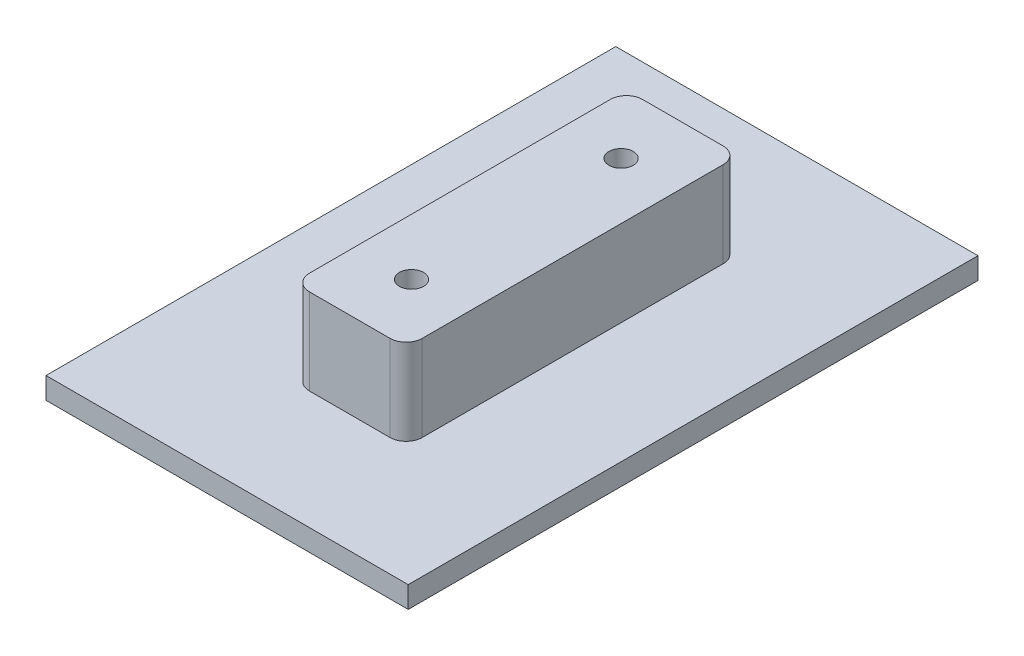
ISO-10303-21;
HEADER;
FILE_DESCRIPTION(('STEP AP214'),'2;1');
FILE_NAME('part.step','',(''),(''),'','','');
FILE_SCHEMA(('AUTOMOTIVE_DESIGN { 1 0 10303 214 1 1 1 1 }'));
ENDSEC;
DATA;
#1=APPLICATION_CONTEXT('core data for automotive mechanical design processes');
#2=APPLICATION_PROTOCOL_DEFINITION('international standard','automotive_design',2000,#1);
#3=PRODUCT_CONTEXT('',#1,'mechanical');
#4=PRODUCT('Part','Part','',(#3));
#5=PRODUCT_RELATED_PRODUCT_CATEGORY('part','',(#4));
#6=PRODUCT_DEFINITION_FORMATION('','',#4);
#7=PRODUCT_DEFINITION_CONTEXT('part definition',#1,'design');
#8=PRODUCT_DEFINITION('design','',#6,#7);
#9=PRODUCT_DEFINITION_SHAPE('','',#8);
#10=(LENGTH_UNIT() NAMED_UNIT(*) SI_UNIT(.MILLI.,.METRE.));
#11=(NAMED_UNIT(*) PLANE_ANGLE_UNIT() SI_UNIT($,.RADIAN.));
#12=(NAMED_UNIT(*) SI_UNIT($,.STERADIAN.) SOLID_ANGLE_UNIT());
#13=UNCERTAINTY_MEASURE_WITH_UNIT(LENGTH_MEASURE(1.E-05),#10,'distance_accuracy_value','');
#14=(GEOMETRIC_REPRESENTATION_CONTEXT(3) GLOBAL_UNCERTAINTY_ASSIGNED_CONTEXT((#13)) GLOBAL_UNIT_ASSIGNED_CONTEXT((#10,
#11,#12)) REPRESENTATION_CONTEXT('',''));
#15=CARTESIAN_POINT('',(0.,0.,0.));
#16=DIRECTION('',(0.,0.,1.));
#17=DIRECTION('',(1.,0.,0.));
#18=AXIS2_PLACEMENT_3D('',#15,#16,#17);
#19=CARTESIAN_POINT('',(-107.000738470902,0.,168.319923824924));
#20=DIRECTION('',(0.,1.,0.));
#21=DIRECTION('',(0.,0.,1.));
#22=AXIS2_PLACEMENT_3D('',#19,#20,#21);
#23=PLANE('',#22);
#24=DIRECTION('',(0.,0.,1.));
#25=VECTOR('',#24,1.);
#26=CARTESIAN_POINT('',(-107.000738470902,0.,-168.319923824925));
#27=LINE('',#26,#25);
#28=CARTESIAN_POINT('',(-107.000738470902,0.,-168.319923824925));
#29=VERTEX_POINT('',#28);
#30=CARTESIAN_POINT('',(-107.000738470902,0.,168.319923824924));
#31=VERTEX_POINT('',#30);
#32=EDGE_CURVE('E203',#29,#31,#27,.T.);
#33=ORIENTED_EDGE('',*,*,#32,.T.);
#34=DIRECTION('',(1.,0.,0.));
#35=VECTOR('',#34,1.);
#36=CARTESIAN_POINT('',(-107.000738470902,0.,168.319923824924));
#37=LINE('',#36,#35);
#38=CARTESIAN_POINT('',(107.000738470902,0.,168.319923824924));
#39=VERTEX_POINT('',#38);
#40=EDGE_CURVE('E208',#31,#39,#37,.T.);
#41=ORIENTED_EDGE('',*,*,#40,.T.);
#42=DIRECTION('',(0.,0.,-1.));
#43=VECTOR('',#42,1.);
#44=CARTESIAN_POINT('',(107.000738470901,0.,-168.319923824925));
#45=LINE('',#44,#43);
#46=CARTESIAN_POINT('',(107.000738470901,0.,-168.319923824925));
#47=VERTEX_POINT('',#46);
#48=EDGE_CURVE('E211',#39,#47,#45,.T.);
#49=ORIENTED_EDGE('',*,*,#48,.T.);
#50=DIRECTION('',(-1.,0.,0.));
#51=VECTOR('',#50,1.);
#52=CARTESIAN_POINT('',(-107.000738470902,0.,-168.319923824925));
#53=LINE('',#52,#51);
#54=EDGE_CURVE('E214',#47,#29,#53,.T.);
#55=ORIENTED_EDGE('',*,*,#54,.T.);
#56=EDGE_LOOP('',(#33,#41,#49,#55));
#57=FACE_BOUND('',#56,.T.);
#58=CARTESIAN_POINT('',(26.3482710557629,0.,88.9));
#59=DIRECTION('',(0.,1.,0.));
#60=DIRECTION('',(0.,0.,1.));
#61=AXIS2_PLACEMENT_3D('',#58,#59,#60);
#62=CIRCLE('',#61,9.52499999999999);
#63=CARTESIAN_POINT('',(26.3482710557629,0.,98.425));
#64=VERTEX_POINT('',#63);
#65=CARTESIAN_POINT('',(35.8732710557629,0.,88.9));
#66=VERTEX_POINT('',#65);
#67=EDGE_CURVE('E146',#64,#66,#62,.T.);
#68=ORIENTED_EDGE('',*,*,#67,.F.);
#69=DIRECTION('',(1.,0.,0.));
#70=VECTOR('',#69,1.);
#71=CARTESIAN_POINT('',(-21.2767289442371,0.,98.425));
#72=LINE('',#71,#70);
#73=CARTESIAN_POINT('',(-21.2767289442371,0.,98.425));
#74=VERTEX_POINT('',#73);
#75=EDGE_CURVE('E55',#74,#64,#72,.T.);
#76=ORIENTED_EDGE('',*,*,#75,.F.);
#77=CARTESIAN_POINT('',(-21.2767289442371,0.,88.9));
#78=DIRECTION('',(0.,1.,0.));
#79=DIRECTION('',(0.,0.,1.));
#80=AXIS2_PLACEMENT_3D('',#77,#78,#79);
#81=CIRCLE('',#80,9.525);
#82=CARTESIAN_POINT('',(-30.8017289442371,0.,88.9));
#83=VERTEX_POINT('',#82);
#84=EDGE_CURVE('E187',#83,#74,#81,.T.);
#85=ORIENTED_EDGE('',*,*,#84,.F.);
#86=DIRECTION('',(0.,0.,1.));
#87=VECTOR('',#86,1.);
#88=CARTESIAN_POINT('',(-30.8017289442371,0.,-88.9));
#89=LINE('',#88,#87);
#90=CARTESIAN_POINT('',(-30.8017289442371,0.,-88.9));
#91=VERTEX_POINT('',#90);
#92=EDGE_CURVE('E184',#91,#83,#89,.T.);
#93=ORIENTED_EDGE('',*,*,#92,.F.);
#94=CARTESIAN_POINT('',(-21.2767289442371,0.,-88.9));
#95=DIRECTION('',(0.,1.,0.));
#96=DIRECTION('',(0.,0.,1.));
#97=AXIS2_PLACEMENT_3D('',#94,#95,#96);
#98=CIRCLE('',#97,9.525);
#99=CARTESIAN_POINT('',(-21.2767289442371,0.,-98.425));
#100=VERTEX_POINT('',#99);
#101=EDGE_CURVE('E181',#100,#91,#98,.T.);
#102=ORIENTED_EDGE('',*,*,#101,.F.);
#103=DIRECTION('',(-1.,0.,0.));
#104=VECTOR('',#103,1.);
#105=CARTESIAN_POINT('',(26.3482710557629,0.,-98.425));
#106=LINE('',#105,#104);
#107=CARTESIAN_POINT('',(26.3482710557629,0.,-98.425));
#108=VERTEX_POINT('',#107);
#109=EDGE_CURVE('E178',#108,#100,#106,.T.);
#110=ORIENTED_EDGE('',*,*,#109,.F.);
#111=CARTESIAN_POINT('',(26.3482710557629,0.,-88.9));
#112=DIRECTION('',(0.,1.,0.));
#113=DIRECTION('',(0.,0.,1.));
#114=AXIS2_PLACEMENT_3D('',#111,#112,#113);
#115=CIRCLE('',#114,9.525);
#116=CARTESIAN_POINT('',(35.8732710557629,0.,-88.9));
#117=VERTEX_POINT('',#116);
#118=EDGE_CURVE('E175',#117,#108,#115,.T.);
#119=ORIENTED_EDGE('',*,*,#118,.F.);
#120=DIRECTION('',(0.,0.,-1.));
#121=VECTOR('',#120,1.);
#122=CARTESIAN_POINT('',(35.8732710557629,0.,88.9));
#123=LINE('',#122,#121);
#124=EDGE_CURVE('E172',#66,#117,#123,.T.);
#125=ORIENTED_EDGE('',*,*,#124,.F.);
#126=EDGE_LOOP('',(#68,#76,#85,#93,#102,#110,#119,#125));
#127=FACE_BOUND('',#126,.T.);
#128=ADVANCED_FACE('F40',(#57,#127),#23,.T.);
#129=CARTESIAN_POINT('',(-107.000738470902,-12.7,-168.319923824925));
#130=DIRECTION('',(-1.,0.,0.));
#131=DIRECTION('',(0.,0.,1.));
#132=AXIS2_PLACEMENT_3D('',#129,#130,#131);
#133=PLANE('',#132);
#134=ORIENTED_EDGE('',*,*,#32,.F.);
#135=DIRECTION('',(0.,1.,0.));
#136=VECTOR('',#135,1.);
#137=CARTESIAN_POINT('',(-107.000738470902,-12.7,-168.319923824925));
#138=LINE('',#137,#136);
#139=CARTESIAN_POINT('',(-107.000738470902,-12.7,-168.319923824925));
#140=VERTEX_POINT('',#139);
#141=EDGE_CURVE('E63',#140,#29,#138,.T.);
#142=ORIENTED_EDGE('',*,*,#141,.F.);
#143=DIRECTION('',(0.,0.,1.));
#144=VECTOR('',#143,1.);
#145=CARTESIAN_POINT('',(-107.000738470902,-12.7,-168.319923824925));
#146=LINE('',#145,#144);
#147=CARTESIAN_POINT('',(-107.000738470902,-12.7,168.319923824924));
#148=VERTEX_POINT('',#147);
#149=EDGE_CURVE('E217',#140,#148,#146,.T.);
#150=ORIENTED_EDGE('',*,*,#149,.T.);
#151=DIRECTION('',(0.,1.,0.));
#152=VECTOR('',#151,1.);
#153=CARTESIAN_POINT('',(-107.000738470902,-12.7,168.319923824924));
#154=LINE('',#153,#152);
#155=EDGE_CURVE('E228',#148,#31,#154,.T.);
#156=ORIENTED_EDGE('',*,*,#155,.T.);
#157=EDGE_LOOP('',(#134,#142,#150,#156));
#158=FACE_BOUND('',#157,.T.);
#159=ADVANCED_FACE('F42',(#158),#133,.T.);
#160=CARTESIAN_POINT('',(-107.000738470902,-12.7,-168.319923824925));
#161=DIRECTION('',(0.,0.,-1.));
#162=DIRECTION('',(-1.,0.,0.));
#163=AXIS2_PLACEMENT_3D('',#160,#161,#162);
#164=PLANE('',#163);
#165=ORIENTED_EDGE('',*,*,#54,.F.);
#166=DIRECTION('',(0.,1.,0.));
#167=VECTOR('',#166,1.);
#168=CARTESIAN_POINT('',(107.000738470901,-12.7,-168.319923824925));
#169=LINE('',#168,#167);
#170=CARTESIAN_POINT('',(107.000738470901,-12.7,-168.319923824925));
#171=VERTEX_POINT('',#170);
#172=EDGE_CURVE('E230',#171,#47,#169,.T.);
#173=ORIENTED_EDGE('',*,*,#172,.F.);
#174=DIRECTION('',(-1.,0.,0.));
#175=VECTOR('',#174,1.);
#176=CARTESIAN_POINT('',(-107.000738470902,-12.7,-168.319923824925));
#177=LINE('',#176,#175);
#178=EDGE_CURVE('E225',#171,#140,#177,.T.);
#179=ORIENTED_EDGE('',*,*,#178,.T.);
#180=ORIENTED_EDGE('',*,*,#141,.T.);
#181=EDGE_LOOP('',(#165,#173,#179,#180));
#182=FACE_BOUND('',#181,.T.);
#183=ADVANCED_FACE('F258',(#182),#164,.T.);
#184=CARTESIAN_POINT('',(107.000738470901,-12.7,-168.319923824925));
#185=DIRECTION('',(1.,0.,0.));
#186=DIRECTION('',(0.,0.,-1.));
#187=AXIS2_PLACEMENT_3D('',#184,#185,#186);
#188=PLANE('',#187);
#189=ORIENTED_EDGE('',*,*,#48,.F.);
#190=DIRECTION('',(0.,1.,0.));
#191=VECTOR('',#190,1.);
#192=CARTESIAN_POINT('',(107.000738470902,-12.7,168.319923824924));
#193=LINE('',#192,#191);
#194=CARTESIAN_POINT('',(107.000738470902,-12.7,168.319923824924));
#195=VERTEX_POINT('',#194);
#196=EDGE_CURVE('E232',#195,#39,#193,.T.);
#197=ORIENTED_EDGE('',*,*,#196,.F.);
#198=DIRECTION('',(0.,0.,-1.));
#199=VECTOR('',#198,1.);
#200=CARTESIAN_POINT('',(107.000738470901,-12.7,-168.319923824925));
#201=LINE('',#200,#199);
#202=EDGE_CURVE('E222',#195,#171,#201,.T.);
#203=ORIENTED_EDGE('',*,*,#202,.T.);
#204=ORIENTED_EDGE('',*,*,#172,.T.);
#205=EDGE_LOOP('',(#189,#197,#203,#204));
#206=FACE_BOUND('',#205,.T.);
#207=ADVANCED_FACE('F400',(#206),#188,.T.);
#208=CARTESIAN_POINT('',(-107.000738470902,-12.7,168.319923824924));
#209=DIRECTION('',(0.,0.,1.));
#210=DIRECTION('',(1.,0.,0.));
#211=AXIS2_PLACEMENT_3D('',#208,#209,#210);
#212=PLANE('',#211);
#213=ORIENTED_EDGE('',*,*,#40,.F.);
#214=ORIENTED_EDGE('',*,*,#155,.F.);
#215=DIRECTION('',(1.,0.,0.));
#216=VECTOR('',#215,1.);
#217=CARTESIAN_POINT('',(-107.000738470902,-12.7,168.319923824924));
#218=LINE('',#217,#216);
#219=EDGE_CURVE('E219',#148,#195,#218,.T.);
#220=ORIENTED_EDGE('',*,*,#219,.T.);
#221=ORIENTED_EDGE('',*,*,#196,.T.);
#222=EDGE_LOOP('',(#213,#214,#220,#221));
#223=FACE_BOUND('',#222,.T.);
#224=ADVANCED_FACE('F394',(#223),#212,.T.);
#225=CARTESIAN_POINT('',(-107.000738470902,-12.7,168.319923824924));
#226=DIRECTION('',(0.,1.,0.));
#227=DIRECTION('',(0.,0.,1.));
#228=AXIS2_PLACEMENT_3D('',#225,#226,#227);
#229=PLANE('',#228);
#230=ORIENTED_EDGE('',*,*,#149,.F.);
#231=ORIENTED_EDGE('',*,*,#178,.F.);
#232=ORIENTED_EDGE('',*,*,#202,.F.);
#233=ORIENTED_EDGE('',*,*,#219,.F.);
#234=EDGE_LOOP('',(#230,#231,#232,#233));
#235=FACE_BOUND('',#234,.T.);
#236=ADVANCED_FACE('F290',(#235),#229,.F.);
#237=CARTESIAN_POINT('',(-21.2767289442371,258.58000530516,98.425));
#238=DIRECTION('',(0.,0.,-1.));
#239=DIRECTION('',(-1.,0.,0.));
#240=AXIS2_PLACEMENT_3D('',#237,#238,#239);
#241=PLANE('',#240);
#242=DIRECTION('',(1.,0.,0.));
#243=VECTOR('',#242,1.);
#244=CARTESIAN_POINT('',(-21.2767289442371,50.7447866221852,98.425));
#245=LINE('',#244,#243);
#246=CARTESIAN_POINT('',(-21.2767289442371,50.7447866221852,98.425));
#247=VERTEX_POINT('',#246);
#248=CARTESIAN_POINT('',(26.3482710557629,50.7447866221852,98.425));
#249=VERTEX_POINT('',#248);
#250=EDGE_CURVE('E132',#247,#249,#245,.T.);
#251=ORIENTED_EDGE('',*,*,#250,.F.);
#252=DIRECTION('',(0.,-1.,0.));
#253=VECTOR('',#252,1.);
#254=CARTESIAN_POINT('',(-21.2767289442371,258.58000530516,98.425));
#255=LINE('',#254,#253);
#256=EDGE_CURVE('E137',#247,#74,#255,.T.);
#257=ORIENTED_EDGE('',*,*,#256,.T.);
#258=ORIENTED_EDGE('',*,*,#75,.T.);
#259=DIRECTION('',(0.,-1.,0.));
#260=VECTOR('',#259,1.);
#261=CARTESIAN_POINT('',(26.3482710557629,258.58000530516,98.425));
#262=LINE('',#261,#260);
#263=EDGE_CURVE('E128',#249,#64,#262,.T.);
#264=ORIENTED_EDGE('',*,*,#263,.F.);
#265=EDGE_LOOP('',(#251,#257,#258,#264));
#266=FACE_BOUND('',#265,.T.);
#267=ADVANCED_FACE('F130',(#266),#241,.F.);
#268=CARTESIAN_POINT('',(-21.2767289442371,258.58000530516,88.9));
#269=DIRECTION('',(0.,-1.,0.));
#270=DIRECTION('',(0.,0.,-1.));
#271=AXIS2_PLACEMENT_3D('',#268,#269,#270);
#272=CYLINDRICAL_SURFACE('',#271,9.525);
#273=CARTESIAN_POINT('',(-21.2767289442371,50.7447866221852,88.9));
#274=DIRECTION('',(0.,1.,0.));
#275=DIRECTION('',(0.,0.,1.));
#276=AXIS2_PLACEMENT_3D('',#273,#274,#275);
#277=CIRCLE('',#276,9.525);
#278=CARTESIAN_POINT('',(-30.8017289442371,50.7447866221852,88.9));
#279=VERTEX_POINT('',#278);
#280=EDGE_CURVE('E151',#279,#247,#277,.T.);
#281=ORIENTED_EDGE('',*,*,#280,.F.);
#282=DIRECTION('',(0.,-1.,0.));
#283=VECTOR('',#282,1.);
#284=CARTESIAN_POINT('',(-30.8017289442371,258.58000530516,88.9));
#285=LINE('',#284,#283);
#286=EDGE_CURVE('E192',#279,#83,#285,.T.);
#287=ORIENTED_EDGE('',*,*,#286,.T.);
#288=ORIENTED_EDGE('',*,*,#84,.T.);
#289=ORIENTED_EDGE('',*,*,#256,.F.);
#290=EDGE_LOOP('',(#281,#287,#288,#289));
#291=FACE_BOUND('',#290,.T.);
#292=ADVANCED_FACE('F282',(#291),#272,.T.);
#293=CARTESIAN_POINT('',(-30.8017289442371,258.58000530516,-88.9));
#294=DIRECTION('',(1.,0.,0.));
#295=DIRECTION('',(0.,0.,-1.));
#296=AXIS2_PLACEMENT_3D('',#293,#294,#295);
#297=PLANE('',#296);
#298=DIRECTION('',(0.,0.,1.));
#299=VECTOR('',#298,1.);
#300=CARTESIAN_POINT('',(-30.8017289442371,50.7447866221852,-88.9));
#301=LINE('',#300,#299);
#302=CARTESIAN_POINT('',(-30.8017289442371,50.7447866221852,-88.9));
#303=VERTEX_POINT('',#302);
#304=EDGE_CURVE('E154',#303,#279,#301,.T.);
#305=ORIENTED_EDGE('',*,*,#304,.F.);
#306=DIRECTION('',(0.,-1.,0.));
#307=VECTOR('',#306,1.);
#308=CARTESIAN_POINT('',(-30.8017289442371,258.58000530516,-88.9));
#309=LINE('',#308,#307);
#310=EDGE_CURVE('E194',#303,#91,#309,.T.);
#311=ORIENTED_EDGE('',*,*,#310,.T.);
#312=ORIENTED_EDGE('',*,*,#92,.T.);
#313=ORIENTED_EDGE('',*,*,#286,.F.);
#314=EDGE_LOOP('',(#305,#311,#312,#313));
#315=FACE_BOUND('',#314,.T.);
#316=ADVANCED_FACE('F280',(#315),#297,.F.);
#317=CARTESIAN_POINT('',(-21.2767289442371,258.58000530516,-88.9));
#318=DIRECTION('',(0.,-1.,0.));
#319=DIRECTION('',(0.,0.,-1.));
#320=AXIS2_PLACEMENT_3D('',#317,#318,#319);
#321=CYLINDRICAL_SURFACE('',#320,9.525);
#322=CARTESIAN_POINT('',(-21.2767289442371,50.7447866221852,-88.9));
#323=DIRECTION('',(0.,1.,0.));
#324=DIRECTION('',(0.,0.,1.));
#325=AXIS2_PLACEMENT_3D('',#322,#323,#324);
#326=CIRCLE('',#325,9.525);
#327=CARTESIAN_POINT('',(-21.2767289442371,50.7447866221852,-98.425));
#328=VERTEX_POINT('',#327);
#329=EDGE_CURVE('E161',#328,#303,#326,.T.);
#330=ORIENTED_EDGE('',*,*,#329,.F.);
#331=DIRECTION('',(0.,-1.,0.));
#332=VECTOR('',#331,1.);
#333=CARTESIAN_POINT('',(-21.2767289442371,258.58000530516,-98.425));
#334=LINE('',#333,#332);
#335=EDGE_CURVE('E196',#328,#100,#334,.T.);
#336=ORIENTED_EDGE('',*,*,#335,.T.);
#337=ORIENTED_EDGE('',*,*,#101,.T.);
#338=ORIENTED_EDGE('',*,*,#310,.F.);
#339=EDGE_LOOP('',(#330,#336,#337,#338));
#340=FACE_BOUND('',#339,.T.);
#341=ADVANCED_FACE('F275',(#340),#321,.T.);
#342=CARTESIAN_POINT('',(26.3482710557629,258.58000530516,-98.425));
#343=DIRECTION('',(0.,0.,1.));
#344=DIRECTION('',(1.,0.,0.));
#345=AXIS2_PLACEMENT_3D('',#342,#343,#344);
#346=PLANE('',#345);
#347=DIRECTION('',(-1.,0.,0.));
#348=VECTOR('',#347,1.);
#349=CARTESIAN_POINT('',(26.3482710557629,50.7447866221852,-98.425));
#350=LINE('',#349,#348);
#351=CARTESIAN_POINT('',(26.3482710557629,50.7447866221852,-98.425));
#352=VERTEX_POINT('',#351);
#353=EDGE_CURVE('E164',#352,#328,#350,.T.);
#354=ORIENTED_EDGE('',*,*,#353,.F.);
#355=DIRECTION('',(0.,-1.,0.));
#356=VECTOR('',#355,1.);
#357=CARTESIAN_POINT('',(26.3482710557629,258.58000530516,-98.425));
#358=LINE('',#357,#356);
#359=EDGE_CURVE('E198',#352,#108,#358,.T.);
#360=ORIENTED_EDGE('',*,*,#359,.T.);
#361=ORIENTED_EDGE('',*,*,#109,.T.);
#362=ORIENTED_EDGE('',*,*,#335,.F.);
#363=EDGE_LOOP('',(#354,#360,#361,#362));
#364=FACE_BOUND('',#363,.T.);
#365=ADVANCED_FACE('F271',(#364),#346,.F.);
#366=CARTESIAN_POINT('',(26.3482710557629,258.58000530516,-88.9));
#367=DIRECTION('',(0.,-1.,0.));
#368=DIRECTION('',(0.,0.,-1.));
#369=AXIS2_PLACEMENT_3D('',#366,#367,#368);
#370=CYLINDRICAL_SURFACE('',#369,9.525);
#371=CARTESIAN_POINT('',(26.3482710557629,50.7447866221852,-88.9));
#372=DIRECTION('',(0.,1.,0.));
#373=DIRECTION('',(0.,0.,1.));
#374=AXIS2_PLACEMENT_3D('',#371,#372,#373);
#375=CIRCLE('',#374,9.525);
#376=CARTESIAN_POINT('',(35.8732710557629,50.7447866221852,-88.9));
#377=VERTEX_POINT('',#376);
#378=EDGE_CURVE('E167',#377,#352,#375,.T.);
#379=ORIENTED_EDGE('',*,*,#378,.F.);
#380=DIRECTION('',(0.,-1.,0.));
#381=VECTOR('',#380,1.);
#382=CARTESIAN_POINT('',(35.8732710557629,258.58000530516,-88.9));
#383=LINE('',#382,#381);
#384=EDGE_CURVE('E200',#377,#117,#383,.T.);
#385=ORIENTED_EDGE('',*,*,#384,.T.);
#386=ORIENTED_EDGE('',*,*,#118,.T.);
#387=ORIENTED_EDGE('',*,*,#359,.F.);
#388=EDGE_LOOP('',(#379,#385,#386,#387));
#389=FACE_BOUND('',#388,.T.);
#390=ADVANCED_FACE('F269',(#389),#370,.T.);
#391=CARTESIAN_POINT('',(35.8732710557629,258.58000530516,88.9));
#392=DIRECTION('',(-1.,0.,0.));
#393=DIRECTION('',(0.,0.,1.));
#394=AXIS2_PLACEMENT_3D('',#391,#392,#393);
#395=PLANE('',#394);
#396=DIRECTION('',(0.,0.,-1.));
#397=VECTOR('',#396,1.);
#398=CARTESIAN_POINT('',(35.8732710557629,50.7447866221852,88.9));
#399=LINE('',#398,#397);
#400=CARTESIAN_POINT('',(35.8732710557629,50.7447866221852,88.9));
#401=VERTEX_POINT('',#400);
#402=EDGE_CURVE('E147',#401,#377,#399,.T.);
#403=ORIENTED_EDGE('',*,*,#402,.F.);
#404=DIRECTION('',(0.,-1.,0.));
#405=VECTOR('',#404,1.);
#406=CARTESIAN_POINT('',(35.8732710557629,258.58000530516,88.9));
#407=LINE('',#406,#405);
#408=EDGE_CURVE('E143',#401,#66,#407,.T.);
#409=ORIENTED_EDGE('',*,*,#408,.T.);
#410=ORIENTED_EDGE('',*,*,#124,.T.);
#411=ORIENTED_EDGE('',*,*,#384,.F.);
#412=EDGE_LOOP('',(#403,#409,#410,#411));
#413=FACE_BOUND('',#412,.T.);
#414=ADVANCED_FACE('F266',(#413),#395,.F.);
#415=CARTESIAN_POINT('',(26.3482710557629,258.58000530516,88.9));
#416=DIRECTION('',(0.,-1.,0.));
#417=DIRECTION('',(0.,0.,-1.));
#418=AXIS2_PLACEMENT_3D('',#415,#416,#417);
#419=CYLINDRICAL_SURFACE('',#418,9.52499999999999);
#420=CARTESIAN_POINT('',(26.3482710557629,50.7447866221852,88.9));
#421=DIRECTION('',(0.,1.,0.));
#422=DIRECTION('',(0.,0.,1.));
#423=AXIS2_PLACEMENT_3D('',#420,#421,#422);
#424=CIRCLE('',#423,9.52499999999999);
#425=EDGE_CURVE('E141',#249,#401,#424,.T.);
#426=ORIENTED_EDGE('',*,*,#425,.F.);
#427=ORIENTED_EDGE('',*,*,#263,.T.);
#428=ORIENTED_EDGE('',*,*,#67,.T.);
#429=ORIENTED_EDGE('',*,*,#408,.F.);
#430=EDGE_LOOP('',(#426,#427,#428,#429));
#431=FACE_BOUND('',#430,.T.);
#432=ADVANCED_FACE('F142',(#431),#419,.T.);
#433=CARTESIAN_POINT('',(2.53577105576287,258.58000530516,61.9125));
#434=DIRECTION('',(0.,-1.,0.));
#435=DIRECTION('',(0.,0.,-1.));
#436=AXIS2_PLACEMENT_3D('',#433,#434,#435);
#437=CYLINDRICAL_SURFACE('',#436,7.14375);
#438=CARTESIAN_POINT('',(2.53577105576287,0.,61.9125));
#439=DIRECTION('',(0.,1.,0.));
#440=DIRECTION('',(0.,0.,1.));
#441=AXIS2_PLACEMENT_3D('',#438,#439,#440);
#442=CIRCLE('',#441,7.14375);
#443=CARTESIAN_POINT('',(2.53577105576287,0.,69.05625));
#444=VERTEX_POINT('',#443);
#445=EDGE_CURVE('E11',#444,#444,#442,.F.);
#446=ORIENTED_EDGE('',*,*,#445,.T.);
#447=EDGE_LOOP('',(#446));
#448=FACE_BOUND('',#447,.T.);
#449=CARTESIAN_POINT('',(2.53577105576287,50.7447866221852,61.9125));
#450=DIRECTION('',(0.,1.,0.));
#451=DIRECTION('',(0.,0.,1.));
#452=AXIS2_PLACEMENT_3D('',#449,#450,#451);
#453=CIRCLE('',#452,7.14375);
#454=CARTESIAN_POINT('',(2.53577105576287,50.7447866221852,69.05625));
#455=VERTEX_POINT('',#454);
#456=EDGE_CURVE('E152',#455,#455,#453,.T.);
#457=ORIENTED_EDGE('',*,*,#456,.T.);
#458=EDGE_LOOP('',(#457));
#459=FACE_BOUND('',#458,.T.);
#460=ADVANCED_FACE('F302',(#448,#459),#437,.F.);
#461=CARTESIAN_POINT('',(2.53577105576287,258.58000530516,-61.9125));
#462=DIRECTION('',(0.,-1.,0.));
#463=DIRECTION('',(0.,0.,-1.));
#464=AXIS2_PLACEMENT_3D('',#461,#462,#463);
#465=CYLINDRICAL_SURFACE('',#464,7.14375);
#466=CARTESIAN_POINT('',(2.53577105576287,0.,-61.9125));
#467=DIRECTION('',(0.,1.,0.));
#468=DIRECTION('',(0.,0.,1.));
#469=AXIS2_PLACEMENT_3D('',#466,#467,#468);
#470=CIRCLE('',#469,7.14375);
#471=CARTESIAN_POINT('',(2.53577105576287,0.,-54.76875));
#472=VERTEX_POINT('',#471);
#473=EDGE_CURVE('E48',#472,#472,#470,.F.);
#474=ORIENTED_EDGE('',*,*,#473,.T.);
#475=EDGE_LOOP('',(#474));
#476=FACE_BOUND('',#475,.T.);
#477=CARTESIAN_POINT('',(2.53577105576287,50.7447866221852,-61.9125));
#478=DIRECTION('',(0.,1.,0.));
#479=DIRECTION('',(0.,0.,1.));
#480=AXIS2_PLACEMENT_3D('',#477,#478,#479);
#481=CIRCLE('',#480,7.14375);
#482=CARTESIAN_POINT('',(2.53577105576287,50.7447866221852,-54.76875));
#483=VERTEX_POINT('',#482);
#484=EDGE_CURVE('E157',#483,#483,#481,.T.);
#485=ORIENTED_EDGE('',*,*,#484,.T.);
#486=EDGE_LOOP('',(#485));
#487=FACE_BOUND('',#486,.T.);
#488=ADVANCED_FACE('F237',(#476,#487),#465,.F.);
#489=CARTESIAN_POINT('',(29.5232710557629,50.7447866221852,92.075));
#490=DIRECTION('',(0.,1.,0.));
#491=DIRECTION('',(0.,0.,1.));
#492=AXIS2_PLACEMENT_3D('',#489,#490,#491);
#493=PLANE('',#492);
#494=ORIENTED_EDGE('',*,*,#484,.F.);
#495=EDGE_LOOP('',(#494));
#496=FACE_BOUND('',#495,.T.);
#497=ORIENTED_EDGE('',*,*,#456,.F.);
#498=EDGE_LOOP('',(#497));
#499=FACE_BOUND('',#498,.T.);
#500=ORIENTED_EDGE('',*,*,#250,.T.);
#501=ORIENTED_EDGE('',*,*,#425,.T.);
#502=ORIENTED_EDGE('',*,*,#402,.T.);
#503=ORIENTED_EDGE('',*,*,#378,.T.);
#504=ORIENTED_EDGE('',*,*,#353,.T.);
#505=ORIENTED_EDGE('',*,*,#329,.T.);
#506=ORIENTED_EDGE('',*,*,#304,.T.);
#507=ORIENTED_EDGE('',*,*,#280,.T.);
#508=EDGE_LOOP('',(#500,#501,#502,#503,#504,#505,#506,#507));
#509=FACE_BOUND('',#508,.T.);
#510=ADVANCED_FACE('F149',(#496,#499,#509),#493,.T.);
#511=ORIENTED_EDGE('',*,*,#473,.F.);
#512=EDGE_LOOP('',(#511));
#513=FACE_BOUND('',#512,.T.);
#514=ADVANCED_FACE('F240',(#513),#23,.T.);
#515=ORIENTED_EDGE('',*,*,#445,.F.);
#516=EDGE_LOOP('',(#515));
#517=FACE_BOUND('',#516,.T.);
#518=ADVANCED_FACE('F242',(#517),#23,.T.);
#519=CLOSED_SHELL('',(#128,#159,#183,#207,#224,#236,#267,#292,#316,#341,#365,#390,#414,#432,
#460,#488,#510,#514,#518));
#520=MANIFOLD_SOLID_BREP('B2',#519);
#521=ADVANCED_BREP_SHAPE_REPRESENTATION('',(#18,#520),#14);
#522=SHAPE_DEFINITION_REPRESENTATION(#9,#521);
ENDSEC;
END-ISO-10303-21;
